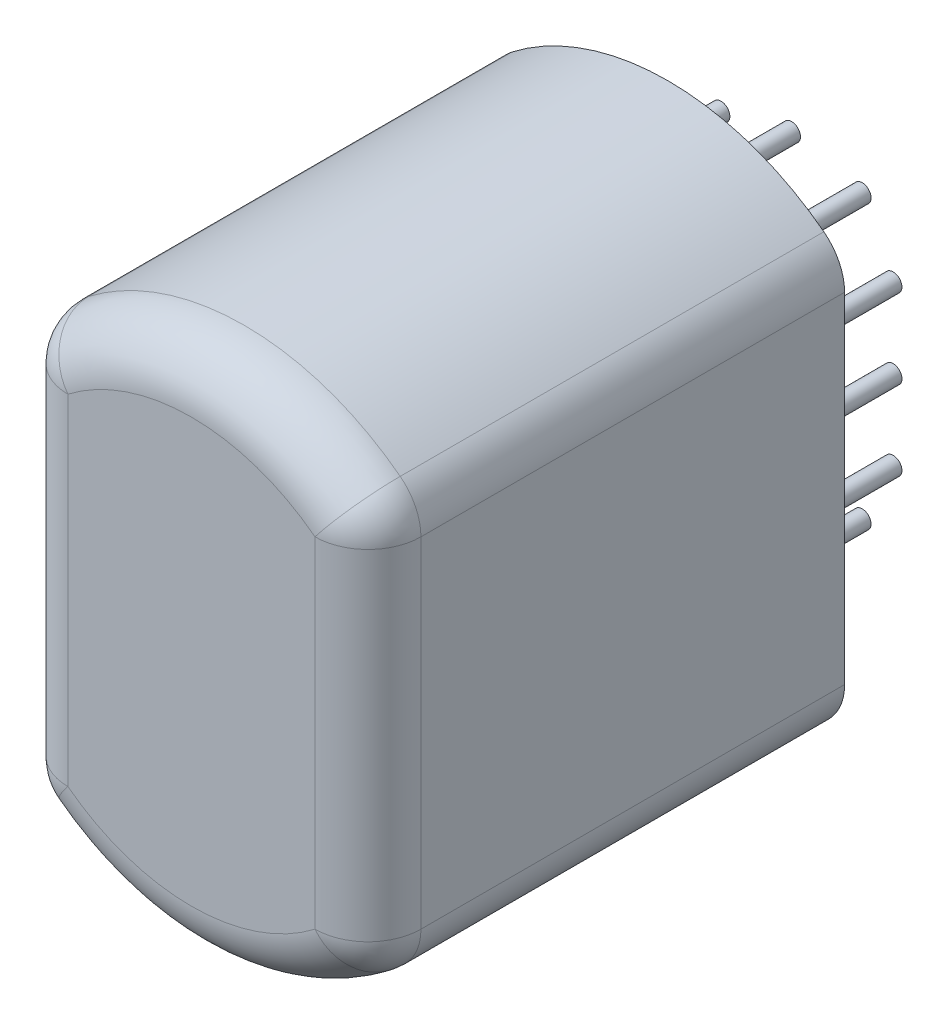
ISO-10303-21;
HEADER;
FILE_DESCRIPTION(('STEP AP214'),'2;1');
FILE_NAME('part.step','',(''),(''),'','','');
FILE_SCHEMA(('AUTOMOTIVE_DESIGN { 1 0 10303 214 1 1 1 1 }'));
ENDSEC;
DATA;
#1=APPLICATION_CONTEXT('core data for automotive mechanical design processes');
#2=APPLICATION_PROTOCOL_DEFINITION('international standard','automotive_design',2000,#1);
#3=PRODUCT_CONTEXT('',#1,'mechanical');
#4=PRODUCT('Part','Part','',(#3));
#5=PRODUCT_RELATED_PRODUCT_CATEGORY('part','',(#4));
#6=PRODUCT_DEFINITION_FORMATION('','',#4);
#7=PRODUCT_DEFINITION_CONTEXT('part definition',#1,'design');
#8=PRODUCT_DEFINITION('design','',#6,#7);
#9=PRODUCT_DEFINITION_SHAPE('','',#8);
#10=(LENGTH_UNIT() NAMED_UNIT(*) SI_UNIT(.MILLI.,.METRE.));
#11=(NAMED_UNIT(*) PLANE_ANGLE_UNIT() SI_UNIT($,.RADIAN.));
#12=(NAMED_UNIT(*) SI_UNIT($,.STERADIAN.) SOLID_ANGLE_UNIT());
#13=UNCERTAINTY_MEASURE_WITH_UNIT(LENGTH_MEASURE(1.E-05),#10,'distance_accuracy_value','');
#14=(GEOMETRIC_REPRESENTATION_CONTEXT(3) GLOBAL_UNCERTAINTY_ASSIGNED_CONTEXT((#13)) GLOBAL_UNIT_ASSIGNED_CONTEXT((#10,
#11,#12)) REPRESENTATION_CONTEXT('',''));
#15=CARTESIAN_POINT('',(0.,0.,0.));
#16=DIRECTION('',(0.,0.,1.));
#17=DIRECTION('',(1.,0.,0.));
#18=AXIS2_PLACEMENT_3D('',#15,#16,#17);
#19=CARTESIAN_POINT('',(5.75,0.,-7.));
#20=DIRECTION('',(0.,0.,1.));
#21=DIRECTION('',(1.,0.,0.));
#22=AXIS2_PLACEMENT_3D('',#19,#20,#21);
#23=CYLINDRICAL_SURFACE('',#22,0.500000000000001);
#24=CARTESIAN_POINT('',(5.75,0.,-7.));
#25=DIRECTION('',(0.,0.,-1.));
#26=DIRECTION('',(-1.,0.,0.));
#27=AXIS2_PLACEMENT_3D('',#24,#25,#26);
#28=CIRCLE('',#27,0.500000000000001);
#29=CARTESIAN_POINT('',(5.25,0.,-7.));
#30=VERTEX_POINT('',#29);
#31=EDGE_CURVE('E11',#30,#30,#28,.T.);
#32=ORIENTED_EDGE('',*,*,#31,.F.);
#33=EDGE_LOOP('',(#32));
#34=FACE_BOUND('',#33,.T.);
#35=CARTESIAN_POINT('',(5.75,0.,0.));
#36=DIRECTION('',(0.,0.,-1.));
#37=DIRECTION('',(-1.,0.,0.));
#38=AXIS2_PLACEMENT_3D('',#35,#36,#37);
#39=CIRCLE('',#38,0.500000000000001);
#40=CARTESIAN_POINT('',(5.25,0.,0.));
#41=VERTEX_POINT('',#40);
#42=EDGE_CURVE('E44',#41,#41,#39,.T.);
#43=ORIENTED_EDGE('',*,*,#42,.T.);
#44=EDGE_LOOP('',(#43));
#45=FACE_BOUND('',#44,.T.);
#46=ADVANCED_FACE('F37',(#34,#45),#23,.T.);
#47=CARTESIAN_POINT('',(5.75,0.,-7.));
#48=DIRECTION('',(0.,0.,-1.));
#49=DIRECTION('',(-1.,0.,0.));
#50=AXIS2_PLACEMENT_3D('',#47,#48,#49);
#51=PLANE('',#50);
#52=ORIENTED_EDGE('',*,*,#31,.T.);
#53=EDGE_LOOP('',(#52));
#54=FACE_BOUND('',#53,.T.);
#55=ADVANCED_FACE('F278',(#54),#51,.T.);
#56=CARTESIAN_POINT('',(0.,0.499999999999999,0.));
#57=DIRECTION('',(0.,0.,-1.));
#58=DIRECTION('',(-1.,0.,0.));
#59=AXIS2_PLACEMENT_3D('',#56,#57,#58);
#60=PLANE('',#59);
#61=CARTESIAN_POINT('',(0.,9.,0.));
#62=DIRECTION('',(0.,0.,-1.));
#63=DIRECTION('',(-1.,0.,0.));
#64=AXIS2_PLACEMENT_3D('',#61,#62,#63);
#65=CIRCLE('',#64,0.5);
#66=CARTESIAN_POINT('',(-0.5,9.,0.));
#67=VERTEX_POINT('',#66);
#68=EDGE_CURVE('E265',#67,#67,#65,.T.);
#69=ORIENTED_EDGE('',*,*,#68,.F.);
#70=EDGE_LOOP('',(#69));
#71=FACE_BOUND('',#70,.T.);
#72=CARTESIAN_POINT('',(5.75,-4.5,0.));
#73=DIRECTION('',(0.,0.,1.));
#74=DIRECTION('',(-1.,0.,0.));
#75=AXIS2_PLACEMENT_3D('',#72,#73,#74);
#76=CIRCLE('',#75,0.500000000000001);
#77=CARTESIAN_POINT('',(5.25,-4.5,0.));
#78=VERTEX_POINT('',#77);
#79=EDGE_CURVE('E255',#78,#78,#76,.T.);
#80=ORIENTED_EDGE('',*,*,#79,.T.);
#81=EDGE_LOOP('',(#80));
#82=FACE_BOUND('',#81,.T.);
#83=CARTESIAN_POINT('',(5.75,4.5,0.));
#84=DIRECTION('',(0.,0.,-1.));
#85=DIRECTION('',(-1.,0.,0.));
#86=AXIS2_PLACEMENT_3D('',#83,#84,#85);
#87=CIRCLE('',#86,0.500000000000001);
#88=CARTESIAN_POINT('',(5.25,4.5,0.));
#89=VERTEX_POINT('',#88);
#90=EDGE_CURVE('E241',#89,#89,#87,.T.);
#91=ORIENTED_EDGE('',*,*,#90,.F.);
#92=EDGE_LOOP('',(#91));
#93=FACE_BOUND('',#92,.T.);
#94=CARTESIAN_POINT('',(-4.,-8.,0.));
#95=DIRECTION('',(0.,0.,-1.));
#96=DIRECTION('',(-1.,0.,0.));
#97=AXIS2_PLACEMENT_3D('',#94,#95,#96);
#98=CIRCLE('',#97,0.5);
#99=CARTESIAN_POINT('',(-4.5,-8.,0.));
#100=VERTEX_POINT('',#99);
#101=EDGE_CURVE('E231',#100,#100,#98,.T.);
#102=ORIENTED_EDGE('',*,*,#101,.F.);
#103=EDGE_LOOP('',(#102));
#104=FACE_BOUND('',#103,.T.);
#105=CARTESIAN_POINT('',(0.,-9.,0.));
#106=DIRECTION('',(0.,0.,1.));
#107=DIRECTION('',(-1.,0.,0.));
#108=AXIS2_PLACEMENT_3D('',#105,#106,#107);
#109=CIRCLE('',#108,0.5);
#110=CARTESIAN_POINT('',(-0.5,-9.,0.));
#111=VERTEX_POINT('',#110);
#112=EDGE_CURVE('E217',#111,#111,#109,.T.);
#113=ORIENTED_EDGE('',*,*,#112,.T.);
#114=EDGE_LOOP('',(#113));
#115=FACE_BOUND('',#114,.T.);
#116=CARTESIAN_POINT('',(4.,-8.,0.));
#117=DIRECTION('',(0.,0.,1.));
#118=DIRECTION('',(-1.,0.,0.));
#119=AXIS2_PLACEMENT_3D('',#116,#117,#118);
#120=CIRCLE('',#119,0.5);
#121=CARTESIAN_POINT('',(3.5,-8.,0.));
#122=VERTEX_POINT('',#121);
#123=EDGE_CURVE('E183',#122,#122,#120,.T.);
#124=ORIENTED_EDGE('',*,*,#123,.T.);
#125=EDGE_LOOP('',(#124));
#126=FACE_BOUND('',#125,.T.);
#127=DIRECTION('',(0.,1.,0.));
#128=VECTOR('',#127,1.);
#129=CARTESIAN_POINT('',(10.,-11.,0.));
#130=LINE('',#129,#128);
#131=CARTESIAN_POINT('',(10.,-9.62414379544733,0.));
#132=VERTEX_POINT('',#131);
#133=CARTESIAN_POINT('',(10.,9.62414379544733,0.));
#134=VERTEX_POINT('',#133);
#135=EDGE_CURVE('E117',#132,#134,#130,.T.);
#136=ORIENTED_EDGE('',*,*,#135,.F.);
#137=CARTESIAN_POINT('',(7.,-9.62414379544733,0.));
#138=DIRECTION('',(0.,0.,-1.));
#139=DIRECTION('',(-1.,0.,0.));
#140=AXIS2_PLACEMENT_3D('',#137,#138,#139);
#141=CIRCLE('',#140,3.);
#142=CARTESIAN_POINT('',(8.82608695652174,-12.0043552203466,0.));
#143=VERTEX_POINT('',#142);
#144=EDGE_CURVE('E123',#132,#143,#141,.T.);
#145=ORIENTED_EDGE('',*,*,#144,.T.);
#146=CARTESIAN_POINT('',(0.,-0.499999999999994,0.));
#147=DIRECTION('',(0.,0.,1.));
#148=DIRECTION('',(1.,0.,0.));
#149=AXIS2_PLACEMENT_3D('',#146,#147,#148);
#150=CIRCLE('',#149,14.5);
#151=CARTESIAN_POINT('',(-8.82608695652174,-12.0043552203466,0.));
#152=VERTEX_POINT('',#151);
#153=EDGE_CURVE('E136',#152,#143,#150,.T.);
#154=ORIENTED_EDGE('',*,*,#153,.F.);
#155=CARTESIAN_POINT('',(-7.,-9.62414379544733,0.));
#156=DIRECTION('',(0.,0.,-1.));
#157=DIRECTION('',(-1.,0.,0.));
#158=AXIS2_PLACEMENT_3D('',#155,#156,#157);
#159=CIRCLE('',#158,3.);
#160=CARTESIAN_POINT('',(-10.,-9.62414379544733,0.));
#161=VERTEX_POINT('',#160);
#162=EDGE_CURVE('E130',#152,#161,#159,.T.);
#163=ORIENTED_EDGE('',*,*,#162,.T.);
#164=DIRECTION('',(0.,-1.,0.));
#165=VECTOR('',#164,1.);
#166=CARTESIAN_POINT('',(-10.,-11.,0.));
#167=LINE('',#166,#165);
#168=CARTESIAN_POINT('',(-10.,9.62414379544732,0.));
#169=VERTEX_POINT('',#168);
#170=EDGE_CURVE('E139',#169,#161,#167,.T.);
#171=ORIENTED_EDGE('',*,*,#170,.F.);
#172=CARTESIAN_POINT('',(-7.,9.62414379544733,0.));
#173=DIRECTION('',(0.,0.,-1.));
#174=DIRECTION('',(-1.,0.,0.));
#175=AXIS2_PLACEMENT_3D('',#172,#173,#174);
#176=CIRCLE('',#175,3.);
#177=CARTESIAN_POINT('',(-8.82608695652174,12.0043552203466,0.));
#178=VERTEX_POINT('',#177);
#179=EDGE_CURVE('E144',#169,#178,#176,.T.);
#180=ORIENTED_EDGE('',*,*,#179,.T.);
#181=CARTESIAN_POINT('',(0.,0.499999999999999,0.));
#182=DIRECTION('',(0.,0.,1.));
#183=DIRECTION('',(-1.,0.,0.));
#184=AXIS2_PLACEMENT_3D('',#181,#182,#183);
#185=CIRCLE('',#184,14.5);
#186=CARTESIAN_POINT('',(8.82608695652174,12.0043552203466,0.));
#187=VERTEX_POINT('',#186);
#188=EDGE_CURVE('E207',#187,#178,#185,.T.);
#189=ORIENTED_EDGE('',*,*,#188,.F.);
#190=CARTESIAN_POINT('',(7.,9.62414379544733,0.));
#191=DIRECTION('',(0.,0.,-1.));
#192=DIRECTION('',(-1.,0.,0.));
#193=AXIS2_PLACEMENT_3D('',#190,#191,#192);
#194=CIRCLE('',#193,3.);
#195=EDGE_CURVE('E120',#187,#134,#194,.T.);
#196=ORIENTED_EDGE('',*,*,#195,.T.);
#197=EDGE_LOOP('',(#136,#145,#154,#163,#171,#180,#189,#196));
#198=FACE_BOUND('',#197,.T.);
#199=CARTESIAN_POINT('',(0.,0.,0.));
#200=DIRECTION('',(0.,0.,-1.));
#201=DIRECTION('',(-1.,0.,0.));
#202=AXIS2_PLACEMENT_3D('',#199,#200,#201);
#203=CIRCLE('',#202,1.75);
#204=CARTESIAN_POINT('',(-1.75,0.,0.));
#205=VERTEX_POINT('',#204);
#206=EDGE_CURVE('E759',#205,#205,#203,.T.);
#207=ORIENTED_EDGE('',*,*,#206,.F.);
#208=EDGE_LOOP('',(#207));
#209=FACE_BOUND('',#208,.T.);
#210=CARTESIAN_POINT('',(-5.75,0.,0.));
#211=DIRECTION('',(0.,0.,1.));
#212=DIRECTION('',(1.,0.,0.));
#213=AXIS2_PLACEMENT_3D('',#210,#211,#212);
#214=CIRCLE('',#213,0.500000000000001);
#215=CARTESIAN_POINT('',(-5.25,0.,0.));
#216=VERTEX_POINT('',#215);
#217=EDGE_CURVE('E211',#216,#216,#214,.T.);
#218=ORIENTED_EDGE('',*,*,#217,.T.);
#219=EDGE_LOOP('',(#218));
#220=FACE_BOUND('',#219,.T.);
#221=CARTESIAN_POINT('',(4.,8.,0.));
#222=DIRECTION('',(0.,0.,-1.));
#223=DIRECTION('',(-1.,0.,0.));
#224=AXIS2_PLACEMENT_3D('',#221,#222,#223);
#225=CIRCLE('',#224,0.5);
#226=CARTESIAN_POINT('',(3.5,8.,0.));
#227=VERTEX_POINT('',#226);
#228=EDGE_CURVE('E223',#227,#227,#225,.T.);
#229=ORIENTED_EDGE('',*,*,#228,.F.);
#230=EDGE_LOOP('',(#229));
#231=FACE_BOUND('',#230,.T.);
#232=CARTESIAN_POINT('',(-4.,8.,0.));
#233=DIRECTION('',(0.,0.,1.));
#234=DIRECTION('',(1.,0.,0.));
#235=AXIS2_PLACEMENT_3D('',#232,#233,#234);
#236=CIRCLE('',#235,0.5);
#237=CARTESIAN_POINT('',(-3.5,8.,0.));
#238=VERTEX_POINT('',#237);
#239=EDGE_CURVE('E237',#238,#238,#236,.T.);
#240=ORIENTED_EDGE('',*,*,#239,.T.);
#241=EDGE_LOOP('',(#240));
#242=FACE_BOUND('',#241,.T.);
#243=CARTESIAN_POINT('',(-5.75,-4.5,0.));
#244=DIRECTION('',(0.,0.,-1.));
#245=DIRECTION('',(-1.,0.,0.));
#246=AXIS2_PLACEMENT_3D('',#243,#244,#245);
#247=CIRCLE('',#246,0.500000000000001);
#248=CARTESIAN_POINT('',(-6.25,-4.5,0.));
#249=VERTEX_POINT('',#248);
#250=EDGE_CURVE('E249',#249,#249,#247,.T.);
#251=ORIENTED_EDGE('',*,*,#250,.F.);
#252=EDGE_LOOP('',(#251));
#253=FACE_BOUND('',#252,.T.);
#254=CARTESIAN_POINT('',(-5.75,4.5,0.));
#255=DIRECTION('',(0.,0.,1.));
#256=DIRECTION('',(1.,0.,0.));
#257=AXIS2_PLACEMENT_3D('',#254,#255,#256);
#258=CIRCLE('',#257,0.500000000000001);
#259=CARTESIAN_POINT('',(-5.25,4.5,0.));
#260=VERTEX_POINT('',#259);
#261=EDGE_CURVE('E259',#260,#260,#258,.T.);
#262=ORIENTED_EDGE('',*,*,#261,.T.);
#263=EDGE_LOOP('',(#262));
#264=FACE_BOUND('',#263,.T.);
#265=ORIENTED_EDGE('',*,*,#42,.F.);
#266=EDGE_LOOP('',(#265));
#267=FACE_BOUND('',#266,.T.);
#268=ADVANCED_FACE('F132',(#71,#82,#93,#104,#115,#126,#198,#209,#220,#231,#242,#253,#264,#267),
#60,.T.);
#269=CARTESIAN_POINT('',(0.,9.,-7.));
#270=DIRECTION('',(0.,0.,1.));
#271=DIRECTION('',(1.,0.,0.));
#272=AXIS2_PLACEMENT_3D('',#269,#270,#271);
#273=CYLINDRICAL_SURFACE('',#272,0.5);
#274=CARTESIAN_POINT('',(0.,9.,-7.));
#275=DIRECTION('',(0.,0.,-1.));
#276=DIRECTION('',(-1.,0.,0.));
#277=AXIS2_PLACEMENT_3D('',#274,#275,#276);
#278=CIRCLE('',#277,0.5);
#279=CARTESIAN_POINT('',(-0.5,9.,-7.));
#280=VERTEX_POINT('',#279);
#281=EDGE_CURVE('E270',#280,#280,#278,.T.);
#282=ORIENTED_EDGE('',*,*,#281,.F.);
#283=EDGE_LOOP('',(#282));
#284=FACE_BOUND('',#283,.T.);
#285=ORIENTED_EDGE('',*,*,#68,.T.);
#286=EDGE_LOOP('',(#285));
#287=FACE_BOUND('',#286,.T.);
#288=ADVANCED_FACE('F277',(#284,#287),#273,.T.);
#289=CARTESIAN_POINT('',(0.,9.,-7.));
#290=DIRECTION('',(0.,0.,-1.));
#291=DIRECTION('',(-1.,0.,0.));
#292=AXIS2_PLACEMENT_3D('',#289,#290,#291);
#293=PLANE('',#292);
#294=ORIENTED_EDGE('',*,*,#281,.T.);
#295=EDGE_LOOP('',(#294));
#296=FACE_BOUND('',#295,.T.);
#297=ADVANCED_FACE('F285',(#296),#293,.T.);
#298=CARTESIAN_POINT('',(-5.75,4.5,-7.));
#299=DIRECTION('',(0.,0.,1.));
#300=DIRECTION('',(-1.,0.,0.));
#301=AXIS2_PLACEMENT_3D('',#298,#299,#300);
#302=CYLINDRICAL_SURFACE('',#301,0.500000000000001);
#303=CARTESIAN_POINT('',(-5.75,4.5,-7.));
#304=DIRECTION('',(0.,0.,1.));
#305=DIRECTION('',(1.,0.,0.));
#306=AXIS2_PLACEMENT_3D('',#303,#304,#305);
#307=CIRCLE('',#306,0.500000000000001);
#308=CARTESIAN_POINT('',(-5.25,4.5,-7.));
#309=VERTEX_POINT('',#308);
#310=EDGE_CURVE('E262',#309,#309,#307,.T.);
#311=ORIENTED_EDGE('',*,*,#310,.T.);
#312=EDGE_LOOP('',(#311));
#313=FACE_BOUND('',#312,.T.);
#314=ORIENTED_EDGE('',*,*,#261,.F.);
#315=EDGE_LOOP('',(#314));
#316=FACE_BOUND('',#315,.T.);
#317=ADVANCED_FACE('F325',(#313,#316),#302,.T.);
#318=CARTESIAN_POINT('',(-5.75,4.5,-7.));
#319=DIRECTION('',(0.,0.,-1.));
#320=DIRECTION('',(1.,0.,0.));
#321=AXIS2_PLACEMENT_3D('',#318,#319,#320);
#322=PLANE('',#321);
#323=ORIENTED_EDGE('',*,*,#310,.F.);
#324=EDGE_LOOP('',(#323));
#325=FACE_BOUND('',#324,.T.);
#326=ADVANCED_FACE('F335',(#325),#322,.T.);
#327=CARTESIAN_POINT('',(5.75,-4.5,-7.));
#328=DIRECTION('',(0.,0.,1.));
#329=DIRECTION('',(1.,0.,0.));
#330=AXIS2_PLACEMENT_3D('',#327,#328,#329);
#331=CYLINDRICAL_SURFACE('',#330,0.500000000000001);
#332=CARTESIAN_POINT('',(5.75,-4.5,-7.));
#333=DIRECTION('',(0.,0.,1.));
#334=DIRECTION('',(-1.,0.,0.));
#335=AXIS2_PLACEMENT_3D('',#332,#333,#334);
#336=CIRCLE('',#335,0.500000000000001);
#337=CARTESIAN_POINT('',(5.25,-4.5,-7.));
#338=VERTEX_POINT('',#337);
#339=EDGE_CURVE('E256',#338,#338,#336,.T.);
#340=ORIENTED_EDGE('',*,*,#339,.T.);
#341=EDGE_LOOP('',(#340));
#342=FACE_BOUND('',#341,.T.);
#343=ORIENTED_EDGE('',*,*,#79,.F.);
#344=EDGE_LOOP('',(#343));
#345=FACE_BOUND('',#344,.T.);
#346=ADVANCED_FACE('F345',(#342,#345),#331,.T.);
#347=CARTESIAN_POINT('',(5.75,-4.5,-7.));
#348=DIRECTION('',(0.,0.,-1.));
#349=DIRECTION('',(-1.,0.,0.));
#350=AXIS2_PLACEMENT_3D('',#347,#348,#349);
#351=PLANE('',#350);
#352=ORIENTED_EDGE('',*,*,#339,.F.);
#353=EDGE_LOOP('',(#352));
#354=FACE_BOUND('',#353,.T.);
#355=ADVANCED_FACE('F355',(#354),#351,.T.);
#356=CARTESIAN_POINT('',(-5.75,-4.5,-7.));
#357=DIRECTION('',(0.,0.,1.));
#358=DIRECTION('',(-1.,0.,0.));
#359=AXIS2_PLACEMENT_3D('',#356,#357,#358);
#360=CYLINDRICAL_SURFACE('',#359,0.500000000000001);
#361=CARTESIAN_POINT('',(-5.75,-4.5,-7.));
#362=DIRECTION('',(0.,0.,-1.));
#363=DIRECTION('',(1.,0.,0.));
#364=AXIS2_PLACEMENT_3D('',#361,#362,#363);
#365=CIRCLE('',#364,0.500000000000001);
#366=CARTESIAN_POINT('',(-5.25,-4.5,-7.));
#367=VERTEX_POINT('',#366);
#368=EDGE_CURVE('E252',#367,#367,#365,.T.);
#369=ORIENTED_EDGE('',*,*,#368,.F.);
#370=EDGE_LOOP('',(#369));
#371=FACE_BOUND('',#370,.T.);
#372=ORIENTED_EDGE('',*,*,#250,.T.);
#373=EDGE_LOOP('',(#372));
#374=FACE_BOUND('',#373,.T.);
#375=ADVANCED_FACE('F365',(#371,#374),#360,.T.);
#376=CARTESIAN_POINT('',(-5.75,-4.5,-7.));
#377=DIRECTION('',(0.,0.,-1.));
#378=DIRECTION('',(1.,0.,0.));
#379=AXIS2_PLACEMENT_3D('',#376,#377,#378);
#380=PLANE('',#379);
#381=ORIENTED_EDGE('',*,*,#368,.T.);
#382=EDGE_LOOP('',(#381));
#383=FACE_BOUND('',#382,.T.);
#384=ADVANCED_FACE('F375',(#383),#380,.T.);
#385=CARTESIAN_POINT('',(5.75,4.5,-7.));
#386=DIRECTION('',(0.,0.,1.));
#387=DIRECTION('',(1.,0.,0.));
#388=AXIS2_PLACEMENT_3D('',#385,#386,#387);
#389=CYLINDRICAL_SURFACE('',#388,0.500000000000001);
#390=CARTESIAN_POINT('',(5.75,4.5,-7.));
#391=DIRECTION('',(0.,0.,-1.));
#392=DIRECTION('',(-1.,0.,0.));
#393=AXIS2_PLACEMENT_3D('',#390,#391,#392);
#394=CIRCLE('',#393,0.500000000000001);
#395=CARTESIAN_POINT('',(5.25,4.5,-7.));
#396=VERTEX_POINT('',#395);
#397=EDGE_CURVE('E246',#396,#396,#394,.T.);
#398=ORIENTED_EDGE('',*,*,#397,.F.);
#399=EDGE_LOOP('',(#398));
#400=FACE_BOUND('',#399,.T.);
#401=ORIENTED_EDGE('',*,*,#90,.T.);
#402=EDGE_LOOP('',(#401));
#403=FACE_BOUND('',#402,.T.);
#404=ADVANCED_FACE('F385',(#400,#403),#389,.T.);
#405=CARTESIAN_POINT('',(5.75,4.5,-7.));
#406=DIRECTION('',(0.,0.,-1.));
#407=DIRECTION('',(-1.,0.,0.));
#408=AXIS2_PLACEMENT_3D('',#405,#406,#407);
#409=PLANE('',#408);
#410=ORIENTED_EDGE('',*,*,#397,.T.);
#411=EDGE_LOOP('',(#410));
#412=FACE_BOUND('',#411,.T.);
#413=ADVANCED_FACE('F395',(#412),#409,.T.);
#414=CARTESIAN_POINT('',(-4.,8.,-7.));
#415=DIRECTION('',(0.,0.,1.));
#416=DIRECTION('',(-1.,0.,0.));
#417=AXIS2_PLACEMENT_3D('',#414,#415,#416);
#418=CYLINDRICAL_SURFACE('',#417,0.5);
#419=CARTESIAN_POINT('',(-4.,8.,-7.));
#420=DIRECTION('',(0.,0.,1.));
#421=DIRECTION('',(1.,0.,0.));
#422=AXIS2_PLACEMENT_3D('',#419,#420,#421);
#423=CIRCLE('',#422,0.5);
#424=CARTESIAN_POINT('',(-3.5,8.,-7.));
#425=VERTEX_POINT('',#424);
#426=EDGE_CURVE('E238',#425,#425,#423,.T.);
#427=ORIENTED_EDGE('',*,*,#426,.T.);
#428=EDGE_LOOP('',(#427));
#429=FACE_BOUND('',#428,.T.);
#430=ORIENTED_EDGE('',*,*,#239,.F.);
#431=EDGE_LOOP('',(#430));
#432=FACE_BOUND('',#431,.T.);
#433=ADVANCED_FACE('F405',(#429,#432),#418,.T.);
#434=CARTESIAN_POINT('',(-4.,8.,-7.));
#435=DIRECTION('',(0.,0.,-1.));
#436=DIRECTION('',(1.,0.,0.));
#437=AXIS2_PLACEMENT_3D('',#434,#435,#436);
#438=PLANE('',#437);
#439=ORIENTED_EDGE('',*,*,#426,.F.);
#440=EDGE_LOOP('',(#439));
#441=FACE_BOUND('',#440,.T.);
#442=ADVANCED_FACE('F415',(#441),#438,.T.);
#443=CARTESIAN_POINT('',(-4.,-8.,-7.));
#444=DIRECTION('',(0.,0.,1.));
#445=DIRECTION('',(-1.,0.,0.));
#446=AXIS2_PLACEMENT_3D('',#443,#444,#445);
#447=CYLINDRICAL_SURFACE('',#446,0.5);
#448=CARTESIAN_POINT('',(-4.,-8.,-7.));
#449=DIRECTION('',(0.,0.,-1.));
#450=DIRECTION('',(1.,0.,0.));
#451=AXIS2_PLACEMENT_3D('',#448,#449,#450);
#452=CIRCLE('',#451,0.5);
#453=CARTESIAN_POINT('',(-3.5,-8.,-7.));
#454=VERTEX_POINT('',#453);
#455=EDGE_CURVE('E234',#454,#454,#452,.T.);
#456=ORIENTED_EDGE('',*,*,#455,.F.);
#457=EDGE_LOOP('',(#456));
#458=FACE_BOUND('',#457,.T.);
#459=ORIENTED_EDGE('',*,*,#101,.T.);
#460=EDGE_LOOP('',(#459));
#461=FACE_BOUND('',#460,.T.);
#462=ADVANCED_FACE('F425',(#458,#461),#447,.T.);
#463=CARTESIAN_POINT('',(-4.,-8.,-7.));
#464=DIRECTION('',(0.,0.,-1.));
#465=DIRECTION('',(1.,0.,0.));
#466=AXIS2_PLACEMENT_3D('',#463,#464,#465);
#467=PLANE('',#466);
#468=ORIENTED_EDGE('',*,*,#455,.T.);
#469=EDGE_LOOP('',(#468));
#470=FACE_BOUND('',#469,.T.);
#471=ADVANCED_FACE('F435',(#470),#467,.T.);
#472=CARTESIAN_POINT('',(4.,8.,-7.));
#473=DIRECTION('',(0.,0.,1.));
#474=DIRECTION('',(1.,0.,0.));
#475=AXIS2_PLACEMENT_3D('',#472,#473,#474);
#476=CYLINDRICAL_SURFACE('',#475,0.5);
#477=CARTESIAN_POINT('',(4.,8.,-7.));
#478=DIRECTION('',(0.,0.,-1.));
#479=DIRECTION('',(-1.,0.,0.));
#480=AXIS2_PLACEMENT_3D('',#477,#478,#479);
#481=CIRCLE('',#480,0.5);
#482=CARTESIAN_POINT('',(3.5,8.,-7.));
#483=VERTEX_POINT('',#482);
#484=EDGE_CURVE('E228',#483,#483,#481,.T.);
#485=ORIENTED_EDGE('',*,*,#484,.F.);
#486=EDGE_LOOP('',(#485));
#487=FACE_BOUND('',#486,.T.);
#488=ORIENTED_EDGE('',*,*,#228,.T.);
#489=EDGE_LOOP('',(#488));
#490=FACE_BOUND('',#489,.T.);
#491=ADVANCED_FACE('F445',(#487,#490),#476,.T.);
#492=CARTESIAN_POINT('',(4.,8.,-7.));
#493=DIRECTION('',(0.,0.,-1.));
#494=DIRECTION('',(-1.,0.,0.));
#495=AXIS2_PLACEMENT_3D('',#492,#493,#494);
#496=PLANE('',#495);
#497=ORIENTED_EDGE('',*,*,#484,.T.);
#498=EDGE_LOOP('',(#497));
#499=FACE_BOUND('',#498,.T.);
#500=ADVANCED_FACE('F455',(#499),#496,.T.);
#501=CARTESIAN_POINT('',(0.,-9.,-7.));
#502=DIRECTION('',(0.,0.,1.));
#503=DIRECTION('',(1.,0.,0.));
#504=AXIS2_PLACEMENT_3D('',#501,#502,#503);
#505=CYLINDRICAL_SURFACE('',#504,0.5);
#506=CARTESIAN_POINT('',(0.,-9.,-7.));
#507=DIRECTION('',(0.,0.,1.));
#508=DIRECTION('',(-1.,0.,0.));
#509=AXIS2_PLACEMENT_3D('',#506,#507,#508);
#510=CIRCLE('',#509,0.5);
#511=CARTESIAN_POINT('',(-0.5,-9.,-7.));
#512=VERTEX_POINT('',#511);
#513=EDGE_CURVE('E220',#512,#512,#510,.T.);
#514=ORIENTED_EDGE('',*,*,#513,.T.);
#515=EDGE_LOOP('',(#514));
#516=FACE_BOUND('',#515,.T.);
#517=ORIENTED_EDGE('',*,*,#112,.F.);
#518=EDGE_LOOP('',(#517));
#519=FACE_BOUND('',#518,.T.);
#520=ADVANCED_FACE('F465',(#516,#519),#505,.T.);
#521=CARTESIAN_POINT('',(0.,-9.,-7.));
#522=DIRECTION('',(0.,0.,-1.));
#523=DIRECTION('',(-1.,0.,0.));
#524=AXIS2_PLACEMENT_3D('',#521,#522,#523);
#525=PLANE('',#524);
#526=ORIENTED_EDGE('',*,*,#513,.F.);
#527=EDGE_LOOP('',(#526));
#528=FACE_BOUND('',#527,.T.);
#529=ADVANCED_FACE('F475',(#528),#525,.T.);
#530=CARTESIAN_POINT('',(-5.75,0.,-7.));
#531=DIRECTION('',(0.,0.,1.));
#532=DIRECTION('',(-1.,0.,0.));
#533=AXIS2_PLACEMENT_3D('',#530,#531,#532);
#534=CYLINDRICAL_SURFACE('',#533,0.500000000000001);
#535=CARTESIAN_POINT('',(-5.75,0.,-7.));
#536=DIRECTION('',(0.,0.,1.));
#537=DIRECTION('',(1.,0.,0.));
#538=AXIS2_PLACEMENT_3D('',#535,#536,#537);
#539=CIRCLE('',#538,0.500000000000001);
#540=CARTESIAN_POINT('',(-5.25,0.,-7.));
#541=VERTEX_POINT('',#540);
#542=EDGE_CURVE('E214',#541,#541,#539,.T.);
#543=ORIENTED_EDGE('',*,*,#542,.T.);
#544=EDGE_LOOP('',(#543));
#545=FACE_BOUND('',#544,.T.);
#546=ORIENTED_EDGE('',*,*,#217,.F.);
#547=EDGE_LOOP('',(#546));
#548=FACE_BOUND('',#547,.T.);
#549=ADVANCED_FACE('F485',(#545,#548),#534,.T.);
#550=CARTESIAN_POINT('',(-5.75,0.,-7.));
#551=DIRECTION('',(0.,0.,-1.));
#552=DIRECTION('',(1.,0.,0.));
#553=AXIS2_PLACEMENT_3D('',#550,#551,#552);
#554=PLANE('',#553);
#555=ORIENTED_EDGE('',*,*,#542,.F.);
#556=EDGE_LOOP('',(#555));
#557=FACE_BOUND('',#556,.T.);
#558=ADVANCED_FACE('F495',(#557),#554,.T.);
#559=CARTESIAN_POINT('',(4.,-8.,-7.));
#560=DIRECTION('',(0.,0.,1.));
#561=DIRECTION('',(1.,0.,0.));
#562=AXIS2_PLACEMENT_3D('',#559,#560,#561);
#563=CYLINDRICAL_SURFACE('',#562,0.5);
#564=CARTESIAN_POINT('',(4.,-8.,-7.));
#565=DIRECTION('',(0.,0.,1.));
#566=DIRECTION('',(-1.,0.,0.));
#567=AXIS2_PLACEMENT_3D('',#564,#565,#566);
#568=CIRCLE('',#567,0.5);
#569=CARTESIAN_POINT('',(3.5,-8.,-7.));
#570=VERTEX_POINT('',#569);
#571=EDGE_CURVE('E208',#570,#570,#568,.T.);
#572=ORIENTED_EDGE('',*,*,#571,.T.);
#573=EDGE_LOOP('',(#572));
#574=FACE_BOUND('',#573,.T.);
#575=ORIENTED_EDGE('',*,*,#123,.F.);
#576=EDGE_LOOP('',(#575));
#577=FACE_BOUND('',#576,.T.);
#578=ADVANCED_FACE('F505',(#574,#577),#563,.T.);
#579=CARTESIAN_POINT('',(4.,-8.,-7.));
#580=DIRECTION('',(0.,0.,-1.));
#581=DIRECTION('',(-1.,0.,0.));
#582=AXIS2_PLACEMENT_3D('',#579,#580,#581);
#583=PLANE('',#582);
#584=ORIENTED_EDGE('',*,*,#571,.F.);
#585=EDGE_LOOP('',(#584));
#586=FACE_BOUND('',#585,.T.);
#587=ADVANCED_FACE('F515',(#586),#583,.T.);
#588=CARTESIAN_POINT('',(0.,0.499999999999999,27.));
#589=DIRECTION('',(0.,0.,-1.));
#590=DIRECTION('',(-1.,0.,0.));
#591=AXIS2_PLACEMENT_3D('',#588,#589,#590);
#592=CYLINDRICAL_SURFACE('',#591,14.5);
#593=DIRECTION('',(0.,0.,-1.));
#594=VECTOR('',#593,1.);
#595=CARTESIAN_POINT('',(-8.82608695652174,12.0043552203466,27.));
#596=LINE('',#595,#594);
#597=CARTESIAN_POINT('',(-8.82608695652174,12.0043552203466,24.));
#598=VERTEX_POINT('',#597);
#599=EDGE_CURVE('E156',#178,#598,#596,.F.);
#600=ORIENTED_EDGE('',*,*,#599,.T.);
#601=CARTESIAN_POINT('',(0.,0.499999999999999,24.));
#602=DIRECTION('',(0.,0.,-1.));
#603=DIRECTION('',(-1.,0.,0.));
#604=AXIS2_PLACEMENT_3D('',#601,#602,#603);
#605=CIRCLE('',#604,14.5);
#606=CARTESIAN_POINT('',(8.82608695652174,12.0043552203466,24.));
#607=VERTEX_POINT('',#606);
#608=EDGE_CURVE('E175',#598,#607,#605,.T.);
#609=ORIENTED_EDGE('',*,*,#608,.T.);
#610=DIRECTION('',(0.,0.,-1.));
#611=VECTOR('',#610,1.);
#612=CARTESIAN_POINT('',(8.82608695652174,12.0043552203466,27.));
#613=LINE('',#612,#611);
#614=EDGE_CURVE('E154',#607,#187,#613,.T.);
#615=ORIENTED_EDGE('',*,*,#614,.T.);
#616=ORIENTED_EDGE('',*,*,#188,.T.);
#617=EDGE_LOOP('',(#600,#609,#615,#616));
#618=FACE_BOUND('',#617,.T.);
#619=ADVANCED_FACE('F525',(#618),#592,.T.);
#620=CARTESIAN_POINT('',(-10.,-11.,27.));
#621=DIRECTION('',(1.,0.,0.));
#622=DIRECTION('',(0.,0.,-1.));
#623=AXIS2_PLACEMENT_3D('',#620,#621,#622);
#624=PLANE('',#623);
#625=DIRECTION('',(0.,0.,-1.));
#626=VECTOR('',#625,1.);
#627=CARTESIAN_POINT('',(-10.,-9.62414379544733,27.));
#628=LINE('',#627,#626);
#629=CARTESIAN_POINT('',(-10.,-9.62414379544733,24.));
#630=VERTEX_POINT('',#629);
#631=EDGE_CURVE('E151',#161,#630,#628,.F.);
#632=ORIENTED_EDGE('',*,*,#631,.T.);
#633=DIRECTION('',(0.,-1.,0.));
#634=VECTOR('',#633,1.);
#635=CARTESIAN_POINT('',(-10.,-11.,24.));
#636=LINE('',#635,#634);
#637=CARTESIAN_POINT('',(-10.,9.62414379544732,24.));
#638=VERTEX_POINT('',#637);
#639=EDGE_CURVE('E171',#630,#638,#636,.F.);
#640=ORIENTED_EDGE('',*,*,#639,.T.);
#641=DIRECTION('',(0.,0.,-1.));
#642=VECTOR('',#641,1.);
#643=CARTESIAN_POINT('',(-10.,9.62414379544732,27.));
#644=LINE('',#643,#642);
#645=EDGE_CURVE('E149',#638,#169,#644,.T.);
#646=ORIENTED_EDGE('',*,*,#645,.T.);
#647=ORIENTED_EDGE('',*,*,#170,.T.);
#648=EDGE_LOOP('',(#632,#640,#646,#647));
#649=FACE_BOUND('',#648,.T.);
#650=ADVANCED_FACE('F535',(#649),#624,.F.);
#651=CARTESIAN_POINT('',(0.,-0.499999999999994,27.));
#652=DIRECTION('',(0.,0.,-1.));
#653=DIRECTION('',(-1.,0.,0.));
#654=AXIS2_PLACEMENT_3D('',#651,#652,#653);
#655=CYLINDRICAL_SURFACE('',#654,14.5);
#656=DIRECTION('',(0.,0.,-1.));
#657=VECTOR('',#656,1.);
#658=CARTESIAN_POINT('',(8.82608695652174,-12.0043552203466,27.));
#659=LINE('',#658,#657);
#660=CARTESIAN_POINT('',(8.82608695652174,-12.0043552203466,24.));
#661=VERTEX_POINT('',#660);
#662=EDGE_CURVE('E125',#143,#661,#659,.F.);
#663=ORIENTED_EDGE('',*,*,#662,.T.);
#664=CARTESIAN_POINT('',(0.,-0.499999999999994,24.));
#665=DIRECTION('',(0.,0.,-1.));
#666=DIRECTION('',(-1.,0.,0.));
#667=AXIS2_PLACEMENT_3D('',#664,#665,#666);
#668=CIRCLE('',#667,14.5);
#669=CARTESIAN_POINT('',(-8.82608695652174,-12.0043552203466,24.));
#670=VERTEX_POINT('',#669);
#671=EDGE_CURVE('E181',#661,#670,#668,.T.);
#672=ORIENTED_EDGE('',*,*,#671,.T.);
#673=DIRECTION('',(0.,0.,-1.));
#674=VECTOR('',#673,1.);
#675=CARTESIAN_POINT('',(-8.82608695652174,-12.0043552203466,27.));
#676=LINE('',#675,#674);
#677=EDGE_CURVE('E129',#670,#152,#676,.T.);
#678=ORIENTED_EDGE('',*,*,#677,.T.);
#679=ORIENTED_EDGE('',*,*,#153,.T.);
#680=EDGE_LOOP('',(#663,#672,#678,#679));
#681=FACE_BOUND('',#680,.T.);
#682=ADVANCED_FACE('F545',(#681),#655,.T.);
#683=CARTESIAN_POINT('',(10.,-11.,27.));
#684=DIRECTION('',(-1.,0.,0.));
#685=DIRECTION('',(0.,0.,1.));
#686=AXIS2_PLACEMENT_3D('',#683,#684,#685);
#687=PLANE('',#686);
#688=DIRECTION('',(0.,0.,-1.));
#689=VECTOR('',#688,1.);
#690=CARTESIAN_POINT('',(10.,9.62414379544733,27.));
#691=LINE('',#690,#689);
#692=CARTESIAN_POINT('',(10.,9.62414379544733,24.));
#693=VERTEX_POINT('',#692);
#694=EDGE_CURVE('E121',#134,#693,#691,.F.);
#695=ORIENTED_EDGE('',*,*,#694,.T.);
#696=DIRECTION('',(0.,1.,0.));
#697=VECTOR('',#696,1.);
#698=CARTESIAN_POINT('',(10.,-11.,24.));
#699=LINE('',#698,#697);
#700=CARTESIAN_POINT('',(10.,-9.62414379544733,24.));
#701=VERTEX_POINT('',#700);
#702=EDGE_CURVE('E59',#693,#701,#699,.F.);
#703=ORIENTED_EDGE('',*,*,#702,.T.);
#704=DIRECTION('',(0.,0.,-1.));
#705=VECTOR('',#704,1.);
#706=CARTESIAN_POINT('',(10.,-9.62414379544733,27.));
#707=LINE('',#706,#705);
#708=EDGE_CURVE('E113',#701,#132,#707,.T.);
#709=ORIENTED_EDGE('',*,*,#708,.T.);
#710=ORIENTED_EDGE('',*,*,#135,.T.);
#711=EDGE_LOOP('',(#695,#703,#709,#710));
#712=FACE_BOUND('',#711,.T.);
#713=ADVANCED_FACE('F115',(#712),#687,.F.);
#714=CARTESIAN_POINT('',(0.,0.499999999999999,27.));
#715=DIRECTION('',(0.,0.,-1.));
#716=DIRECTION('',(-1.,0.,0.));
#717=AXIS2_PLACEMENT_3D('',#714,#715,#716);
#718=PLANE('',#717);
#719=CARTESIAN_POINT('',(0.,0.499999999999999,27.));
#720=DIRECTION('',(0.,0.,-1.));
#721=DIRECTION('',(-1.,0.,0.));
#722=AXIS2_PLACEMENT_3D('',#719,#720,#721);
#723=CIRCLE('',#722,11.5);
#724=CARTESIAN_POINT('',(7.,9.62414379544733,27.));
#725=VERTEX_POINT('',#724);
#726=CARTESIAN_POINT('',(-7.,9.62414379544733,27.));
#727=VERTEX_POINT('',#726);
#728=EDGE_CURVE('E166',#725,#727,#723,.F.);
#729=ORIENTED_EDGE('',*,*,#728,.T.);
#730=DIRECTION('',(0.,-1.,0.));
#731=VECTOR('',#730,1.);
#732=CARTESIAN_POINT('',(-7.,0.499999999999999,27.));
#733=LINE('',#732,#731);
#734=CARTESIAN_POINT('',(-7.,-9.62414379544733,27.));
#735=VERTEX_POINT('',#734);
#736=EDGE_CURVE('E168',#727,#735,#733,.T.);
#737=ORIENTED_EDGE('',*,*,#736,.T.);
#738=CARTESIAN_POINT('',(0.,-0.499999999999994,27.));
#739=DIRECTION('',(0.,0.,-1.));
#740=DIRECTION('',(-1.,0.,0.));
#741=AXIS2_PLACEMENT_3D('',#738,#739,#740);
#742=CIRCLE('',#741,11.5);
#743=CARTESIAN_POINT('',(7.,-9.62414379544733,27.));
#744=VERTEX_POINT('',#743);
#745=EDGE_CURVE('E162',#735,#744,#742,.F.);
#746=ORIENTED_EDGE('',*,*,#745,.T.);
#747=DIRECTION('',(0.,1.,0.));
#748=VECTOR('',#747,1.);
#749=CARTESIAN_POINT('',(7.,0.499999999999999,27.));
#750=LINE('',#749,#748);
#751=EDGE_CURVE('E164',#744,#725,#750,.T.);
#752=ORIENTED_EDGE('',*,*,#751,.T.);
#753=EDGE_LOOP('',(#729,#737,#746,#752));
#754=FACE_BOUND('',#753,.T.);
#755=ADVANCED_FACE('F564',(#754),#718,.F.);
#756=CARTESIAN_POINT('',(7.,-9.62414379544733,27.));
#757=DIRECTION('',(0.,0.,-1.));
#758=DIRECTION('',(-1.,0.,0.));
#759=AXIS2_PLACEMENT_3D('',#756,#757,#758);
#760=CYLINDRICAL_SURFACE('',#759,3.);
#761=ORIENTED_EDGE('',*,*,#708,.F.);
#762=CARTESIAN_POINT('',(7.,-9.62414379544733,24.));
#763=DIRECTION('',(0.,0.,-1.));
#764=DIRECTION('',(-1.,0.,0.));
#765=AXIS2_PLACEMENT_3D('',#762,#763,#764);
#766=CIRCLE('',#765,3.);
#767=EDGE_CURVE('E51',#701,#661,#766,.T.);
#768=ORIENTED_EDGE('',*,*,#767,.T.);
#769=ORIENTED_EDGE('',*,*,#662,.F.);
#770=ORIENTED_EDGE('',*,*,#144,.F.);
#771=EDGE_LOOP('',(#761,#768,#769,#770));
#772=FACE_BOUND('',#771,.T.);
#773=ADVANCED_FACE('F124',(#772),#760,.T.);
#774=CARTESIAN_POINT('',(-7.,-9.62414379544733,27.));
#775=DIRECTION('',(0.,0.,-1.));
#776=DIRECTION('',(-1.,0.,0.));
#777=AXIS2_PLACEMENT_3D('',#774,#775,#776);
#778=CYLINDRICAL_SURFACE('',#777,3.);
#779=ORIENTED_EDGE('',*,*,#677,.F.);
#780=CARTESIAN_POINT('',(-7.,-9.62414379544733,24.));
#781=DIRECTION('',(0.,0.,-1.));
#782=DIRECTION('',(-1.,0.,0.));
#783=AXIS2_PLACEMENT_3D('',#780,#781,#782);
#784=CIRCLE('',#783,3.);
#785=EDGE_CURVE('E159',#670,#630,#784,.T.);
#786=ORIENTED_EDGE('',*,*,#785,.T.);
#787=ORIENTED_EDGE('',*,*,#631,.F.);
#788=ORIENTED_EDGE('',*,*,#162,.F.);
#789=EDGE_LOOP('',(#779,#786,#787,#788));
#790=FACE_BOUND('',#789,.T.);
#791=ADVANCED_FACE('F580',(#790),#778,.T.);
#792=CARTESIAN_POINT('',(-7.,9.62414379544733,27.));
#793=DIRECTION('',(0.,0.,-1.));
#794=DIRECTION('',(-1.,0.,0.));
#795=AXIS2_PLACEMENT_3D('',#792,#793,#794);
#796=CYLINDRICAL_SURFACE('',#795,3.);
#797=ORIENTED_EDGE('',*,*,#645,.F.);
#798=CARTESIAN_POINT('',(-7.,9.62414379544733,24.));
#799=DIRECTION('',(0.,0.,-1.));
#800=DIRECTION('',(-1.,0.,0.));
#801=AXIS2_PLACEMENT_3D('',#798,#799,#800);
#802=CIRCLE('',#801,3.);
#803=EDGE_CURVE('E173',#638,#598,#802,.T.);
#804=ORIENTED_EDGE('',*,*,#803,.T.);
#805=ORIENTED_EDGE('',*,*,#599,.F.);
#806=ORIENTED_EDGE('',*,*,#179,.F.);
#807=EDGE_LOOP('',(#797,#804,#805,#806));
#808=FACE_BOUND('',#807,.T.);
#809=ADVANCED_FACE('F589',(#808),#796,.T.);
#810=CARTESIAN_POINT('',(7.,9.62414379544733,27.));
#811=DIRECTION('',(0.,0.,-1.));
#812=DIRECTION('',(-1.,0.,0.));
#813=AXIS2_PLACEMENT_3D('',#810,#811,#812);
#814=CYLINDRICAL_SURFACE('',#813,3.);
#815=ORIENTED_EDGE('',*,*,#614,.F.);
#816=CARTESIAN_POINT('',(7.,9.62414379544733,24.));
#817=DIRECTION('',(0.,0.,-1.));
#818=DIRECTION('',(-1.,0.,0.));
#819=AXIS2_PLACEMENT_3D('',#816,#817,#818);
#820=CIRCLE('',#819,3.);
#821=EDGE_CURVE('E177',#607,#693,#820,.T.);
#822=ORIENTED_EDGE('',*,*,#821,.T.);
#823=ORIENTED_EDGE('',*,*,#694,.F.);
#824=ORIENTED_EDGE('',*,*,#195,.F.);
#825=EDGE_LOOP('',(#815,#822,#823,#824));
#826=FACE_BOUND('',#825,.T.);
#827=ADVANCED_FACE('F599',(#826),#814,.T.);
#828=CARTESIAN_POINT('',(7.,9.62414379544733,24.));
#829=DIRECTION('',(0.,0.,1.));
#830=DIRECTION('',(1.,0.,0.));
#831=AXIS2_PLACEMENT_3D('',#828,#829,#830);
#832=SPHERICAL_SURFACE('',#831,3.);
#833=CARTESIAN_POINT('',(7.,9.62414379544733,24.));
#834=DIRECTION('',(0.,-1.,0.));
#835=DIRECTION('',(1.,0.,0.));
#836=AXIS2_PLACEMENT_3D('',#833,#834,#835);
#837=CIRCLE('',#836,3.);
#838=EDGE_CURVE('E201',#693,#725,#837,.T.);
#839=ORIENTED_EDGE('',*,*,#838,.F.);
#840=ORIENTED_EDGE('',*,*,#821,.F.);
#841=CARTESIAN_POINT('',(7.,9.62414379544733,24.));
#842=DIRECTION('',(-0.793403808299768,0.608695652173913,0.));
#843=DIRECTION('',(-0.608695652173913,-0.793403808299768,0.));
#844=AXIS2_PLACEMENT_3D('',#841,#842,#843);
#845=CIRCLE('',#844,3.);
#846=EDGE_CURVE('E204',#725,#607,#845,.T.);
#847=ORIENTED_EDGE('',*,*,#846,.F.);
#848=EDGE_LOOP('',(#839,#840,#847));
#849=FACE_BOUND('',#848,.T.);
#850=ADVANCED_FACE('F609',(#849),#832,.T.);
#851=CARTESIAN_POINT('',(0.,0.499999999999999,24.));
#852=DIRECTION('',(0.,0.,-1.));
#853=DIRECTION('',(-1.,0.,0.));
#854=AXIS2_PLACEMENT_3D('',#851,#852,#853);
#855=TOROIDAL_SURFACE('',#854,11.5,3.);
#856=ORIENTED_EDGE('',*,*,#846,.T.);
#857=ORIENTED_EDGE('',*,*,#608,.F.);
#858=CARTESIAN_POINT('',(-7.,9.62414379544733,24.));
#859=DIRECTION('',(-0.793403808299768,-0.608695652173913,0.));
#860=DIRECTION('',(0.608695652173913,-0.793403808299768,0.));
#861=AXIS2_PLACEMENT_3D('',#858,#859,#860);
#862=CIRCLE('',#861,3.);
#863=EDGE_CURVE('E198',#727,#598,#862,.T.);
#864=ORIENTED_EDGE('',*,*,#863,.F.);
#865=ORIENTED_EDGE('',*,*,#728,.F.);
#866=EDGE_LOOP('',(#856,#857,#864,#865));
#867=FACE_BOUND('',#866,.T.);
#868=ADVANCED_FACE('F619',(#867),#855,.T.);
#869=CARTESIAN_POINT('',(7.,0.499999999999999,24.));
#870=DIRECTION('',(0.,1.,0.));
#871=DIRECTION('',(0.,0.,1.));
#872=AXIS2_PLACEMENT_3D('',#869,#870,#871);
#873=CYLINDRICAL_SURFACE('',#872,3.);
#874=ORIENTED_EDGE('',*,*,#838,.T.);
#875=ORIENTED_EDGE('',*,*,#751,.F.);
#876=CARTESIAN_POINT('',(7.,-9.62414379544733,24.));
#877=DIRECTION('',(0.,-1.,0.));
#878=DIRECTION('',(0.,0.,-1.));
#879=AXIS2_PLACEMENT_3D('',#876,#877,#878);
#880=CIRCLE('',#879,3.);
#881=EDGE_CURVE('E195',#701,#744,#880,.T.);
#882=ORIENTED_EDGE('',*,*,#881,.F.);
#883=ORIENTED_EDGE('',*,*,#702,.F.);
#884=EDGE_LOOP('',(#874,#875,#882,#883));
#885=FACE_BOUND('',#884,.T.);
#886=ADVANCED_FACE('F630',(#885),#873,.T.);
#887=CARTESIAN_POINT('',(-7.,9.62414379544733,24.));
#888=DIRECTION('',(0.,0.,1.));
#889=DIRECTION('',(1.,0.,0.));
#890=AXIS2_PLACEMENT_3D('',#887,#888,#889);
#891=SPHERICAL_SURFACE('',#890,3.);
#892=ORIENTED_EDGE('',*,*,#863,.T.);
#893=ORIENTED_EDGE('',*,*,#803,.F.);
#894=CARTESIAN_POINT('',(-7.,9.62414379544733,24.));
#895=DIRECTION('',(0.,-1.,0.));
#896=DIRECTION('',(1.,0.,0.));
#897=AXIS2_PLACEMENT_3D('',#894,#895,#896);
#898=CIRCLE('',#897,3.);
#899=EDGE_CURVE('E192',#727,#638,#898,.T.);
#900=ORIENTED_EDGE('',*,*,#899,.F.);
#901=EDGE_LOOP('',(#892,#893,#900));
#902=FACE_BOUND('',#901,.T.);
#903=ADVANCED_FACE('F640',(#902),#891,.T.);
#904=CARTESIAN_POINT('',(7.,-9.62414379544733,24.));
#905=DIRECTION('',(0.,0.,1.));
#906=DIRECTION('',(1.,0.,0.));
#907=AXIS2_PLACEMENT_3D('',#904,#905,#906);
#908=SPHERICAL_SURFACE('',#907,3.);
#909=ORIENTED_EDGE('',*,*,#767,.F.);
#910=ORIENTED_EDGE('',*,*,#881,.T.);
#911=CARTESIAN_POINT('',(7.,-9.62414379544733,24.));
#912=DIRECTION('',(-0.793403808299768,-0.608695652173913,0.));
#913=DIRECTION('',(0.608695652173913,-0.793403808299768,0.));
#914=AXIS2_PLACEMENT_3D('',#911,#912,#913);
#915=CIRCLE('',#914,3.);
#916=EDGE_CURVE('E189',#661,#744,#915,.T.);
#917=ORIENTED_EDGE('',*,*,#916,.F.);
#918=EDGE_LOOP('',(#909,#910,#917));
#919=FACE_BOUND('',#918,.T.);
#920=ADVANCED_FACE('F650',(#919),#908,.T.);
#921=CARTESIAN_POINT('',(-7.,0.499999999999999,24.));
#922=DIRECTION('',(0.,-1.,0.));
#923=DIRECTION('',(0.,0.,-1.));
#924=AXIS2_PLACEMENT_3D('',#921,#922,#923);
#925=CYLINDRICAL_SURFACE('',#924,3.);
#926=ORIENTED_EDGE('',*,*,#899,.T.);
#927=ORIENTED_EDGE('',*,*,#639,.F.);
#928=CARTESIAN_POINT('',(-7.,-9.62414379544733,24.));
#929=DIRECTION('',(0.,-1.,0.));
#930=DIRECTION('',(0.,0.,-1.));
#931=AXIS2_PLACEMENT_3D('',#928,#929,#930);
#932=CIRCLE('',#931,3.);
#933=EDGE_CURVE('E186',#735,#630,#932,.T.);
#934=ORIENTED_EDGE('',*,*,#933,.F.);
#935=ORIENTED_EDGE('',*,*,#736,.F.);
#936=EDGE_LOOP('',(#926,#927,#934,#935));
#937=FACE_BOUND('',#936,.T.);
#938=ADVANCED_FACE('F661',(#937),#925,.T.);
#939=CARTESIAN_POINT('',(0.,-0.499999999999994,24.));
#940=DIRECTION('',(0.,0.,-1.));
#941=DIRECTION('',(-1.,0.,0.));
#942=AXIS2_PLACEMENT_3D('',#939,#940,#941);
#943=TOROIDAL_SURFACE('',#942,11.5,3.);
#944=ORIENTED_EDGE('',*,*,#916,.T.);
#945=ORIENTED_EDGE('',*,*,#745,.F.);
#946=CARTESIAN_POINT('',(-7.,-9.62414379544733,24.));
#947=DIRECTION('',(-0.793403808299768,0.608695652173913,0.));
#948=DIRECTION('',(-0.608695652173913,-0.793403808299768,0.));
#949=AXIS2_PLACEMENT_3D('',#946,#947,#948);
#950=CIRCLE('',#949,3.);
#951=EDGE_CURVE('E184',#670,#735,#950,.T.);
#952=ORIENTED_EDGE('',*,*,#951,.F.);
#953=ORIENTED_EDGE('',*,*,#671,.F.);
#954=EDGE_LOOP('',(#944,#945,#952,#953));
#955=FACE_BOUND('',#954,.T.);
#956=ADVANCED_FACE('F672',(#955),#943,.T.);
#957=CARTESIAN_POINT('',(-7.,-9.62414379544733,24.));
#958=DIRECTION('',(0.,0.,1.));
#959=DIRECTION('',(1.,0.,0.));
#960=AXIS2_PLACEMENT_3D('',#957,#958,#959);
#961=SPHERICAL_SURFACE('',#960,3.);
#962=ORIENTED_EDGE('',*,*,#933,.T.);
#963=ORIENTED_EDGE('',*,*,#785,.F.);
#964=ORIENTED_EDGE('',*,*,#951,.T.);
#965=EDGE_LOOP('',(#962,#963,#964));
#966=FACE_BOUND('',#965,.T.);
#967=ADVANCED_FACE('F682',(#966),#961,.T.);
#968=CARTESIAN_POINT('',(0.,0.,-7.));
#969=DIRECTION('',(0.,0.,1.));
#970=DIRECTION('',(1.,0.,0.));
#971=AXIS2_PLACEMENT_3D('',#968,#969,#970);
#972=CYLINDRICAL_SURFACE('',#971,1.75);
#973=CARTESIAN_POINT('',(0.,0.,-7.));
#974=DIRECTION('',(0.,0.,-1.));
#975=DIRECTION('',(-1.,0.,0.));
#976=AXIS2_PLACEMENT_3D('',#973,#974,#975);
#977=CIRCLE('',#976,1.75);
#978=CARTESIAN_POINT('',(-1.75,0.,-7.));
#979=VERTEX_POINT('',#978);
#980=EDGE_CURVE('E187',#979,#979,#977,.T.);
#981=ORIENTED_EDGE('',*,*,#980,.F.);
#982=EDGE_LOOP('',(#981));
#983=FACE_BOUND('',#982,.T.);
#984=ORIENTED_EDGE('',*,*,#206,.T.);
#985=EDGE_LOOP('',(#984));
#986=FACE_BOUND('',#985,.T.);
#987=ADVANCED_FACE('F692',(#983,#986),#972,.T.);
#988=CARTESIAN_POINT('',(0.,0.,-7.));
#989=DIRECTION('',(0.,0.,-1.));
#990=DIRECTION('',(-1.,0.,0.));
#991=AXIS2_PLACEMENT_3D('',#988,#989,#990);
#992=PLANE('',#991);
#993=ORIENTED_EDGE('',*,*,#980,.T.);
#994=EDGE_LOOP('',(#993));
#995=FACE_BOUND('',#994,.T.);
#996=ADVANCED_FACE('F703',(#995),#992,.T.);
#997=CLOSED_SHELL('',(#46,#55,#268,#288,#297,#317,#326,#346,#355,#375,#384,#404,#413,#433,#442,
#462,#471,#491,#500,#520,#529,#549,#558,#578,#587,#619,#650,#682,#713,#755,#773,#791,#809,#827,
#850,#868,#886,#903,#920,#938,#956,#967,#987,#996));
#998=MANIFOLD_SOLID_BREP('B2',#997);
#999=ADVANCED_BREP_SHAPE_REPRESENTATION('',(#18,#998),#14);
#1000=SHAPE_DEFINITION_REPRESENTATION(#9,#999);
ENDSEC;
END-ISO-10303-21;
